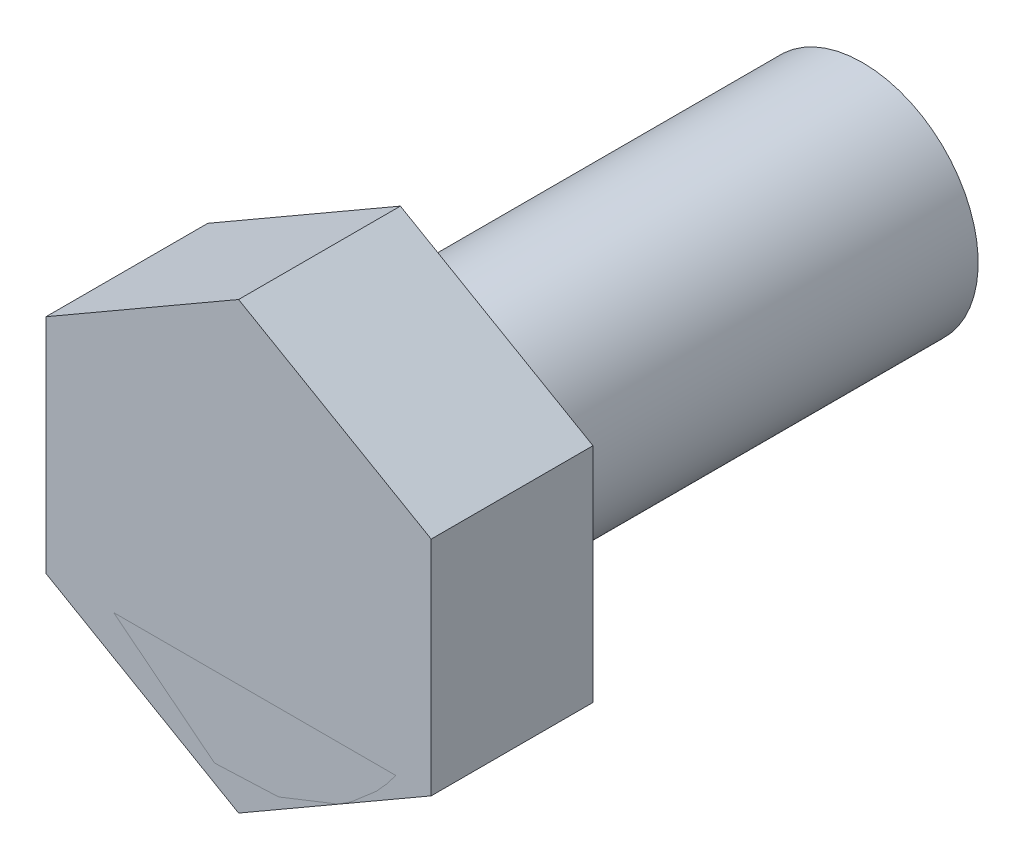
ISO-10303-21;
HEADER;
FILE_DESCRIPTION(('STEP AP214'),'2;1');
FILE_NAME('part.step','',(''),(''),'','','');
FILE_SCHEMA(('AUTOMOTIVE_DESIGN { 1 0 10303 214 1 1 1 1 }'));
ENDSEC;
DATA;
#1=APPLICATION_CONTEXT('core data for automotive mechanical design processes');
#2=APPLICATION_PROTOCOL_DEFINITION('international standard','automotive_design',2000,#1);
#3=PRODUCT_CONTEXT('',#1,'mechanical');
#4=PRODUCT('Part','Part','',(#3));
#5=PRODUCT_RELATED_PRODUCT_CATEGORY('part','',(#4));
#6=PRODUCT_DEFINITION_FORMATION('','',#4);
#7=PRODUCT_DEFINITION_CONTEXT('part definition',#1,'design');
#8=PRODUCT_DEFINITION('design','',#6,#7);
#9=PRODUCT_DEFINITION_SHAPE('','',#8);
#10=(LENGTH_UNIT() NAMED_UNIT(*) SI_UNIT(.MILLI.,.METRE.));
#11=(NAMED_UNIT(*) PLANE_ANGLE_UNIT() SI_UNIT($,.RADIAN.));
#12=(NAMED_UNIT(*) SI_UNIT($,.STERADIAN.) SOLID_ANGLE_UNIT());
#13=UNCERTAINTY_MEASURE_WITH_UNIT(LENGTH_MEASURE(1.E-05),#10,'distance_accuracy_value','');
#14=(GEOMETRIC_REPRESENTATION_CONTEXT(3) GLOBAL_UNCERTAINTY_ASSIGNED_CONTEXT((#13)) GLOBAL_UNIT_ASSIGNED_CONTEXT((#10,
#11,#12)) REPRESENTATION_CONTEXT('',''));
#15=CARTESIAN_POINT('',(0.,0.,0.));
#16=DIRECTION('',(0.,0.,1.));
#17=DIRECTION('',(1.,0.,0.));
#18=AXIS2_PLACEMENT_3D('',#15,#16,#17);
#19=CARTESIAN_POINT('',(5.,2.88675134594813,3.9));
#20=DIRECTION('',(0.5,0.866025403784439,0.));
#21=DIRECTION('',(-0.866025403784439,0.5,0.));
#22=AXIS2_PLACEMENT_3D('',#19,#20,#21);
#23=PLANE('',#22);
#24=DIRECTION('',(-0.866025403784439,0.5,0.));
#25=VECTOR('',#24,1.);
#26=CARTESIAN_POINT('',(5.,2.88675134594813,8.1));
#27=LINE('',#26,#25);
#28=CARTESIAN_POINT('',(5.,2.88675134594813,8.1));
#29=VERTEX_POINT('',#28);
#30=CARTESIAN_POINT('',(0.,5.77350269189626,8.1));
#31=VERTEX_POINT('',#30);
#32=EDGE_CURVE('E130',#29,#31,#27,.T.);
#33=ORIENTED_EDGE('',*,*,#32,.F.);
#34=DIRECTION('',(0.,0.,1.));
#35=VECTOR('',#34,1.);
#36=CARTESIAN_POINT('',(5.,2.88675134594813,3.9));
#37=LINE('',#36,#35);
#38=CARTESIAN_POINT('',(5.,2.88675134594813,3.9));
#39=VERTEX_POINT('',#38);
#40=EDGE_CURVE('E12',#39,#29,#37,.T.);
#41=ORIENTED_EDGE('',*,*,#40,.F.);
#42=DIRECTION('',(-0.866025403784439,0.5,0.));
#43=VECTOR('',#42,1.);
#44=CARTESIAN_POINT('',(5.,2.88675134594813,3.9));
#45=LINE('',#44,#43);
#46=CARTESIAN_POINT('',(0.,5.77350269189626,3.9));
#47=VERTEX_POINT('',#46);
#48=EDGE_CURVE('E144',#39,#47,#45,.T.);
#49=ORIENTED_EDGE('',*,*,#48,.T.);
#50=DIRECTION('',(0.,0.,1.));
#51=VECTOR('',#50,1.);
#52=CARTESIAN_POINT('',(0.,5.77350269189626,3.9));
#53=LINE('',#52,#51);
#54=EDGE_CURVE('E48',#47,#31,#53,.T.);
#55=ORIENTED_EDGE('',*,*,#54,.T.);
#56=EDGE_LOOP('',(#33,#41,#49,#55));
#57=FACE_BOUND('',#56,.T.);
#58=ADVANCED_FACE('F45',(#57),#23,.T.);
#59=CARTESIAN_POINT('',(5.,-2.88675134594813,3.9));
#60=DIRECTION('',(1.,0.,0.));
#61=DIRECTION('',(0.,0.,-1.));
#62=AXIS2_PLACEMENT_3D('',#59,#60,#61);
#63=PLANE('',#62);
#64=DIRECTION('',(0.,1.,0.));
#65=VECTOR('',#64,1.);
#66=CARTESIAN_POINT('',(5.,-2.88675134594813,8.1));
#67=LINE('',#66,#65);
#68=CARTESIAN_POINT('',(5.,-2.88675134594813,8.1));
#69=VERTEX_POINT('',#68);
#70=EDGE_CURVE('E142',#69,#29,#67,.T.);
#71=ORIENTED_EDGE('',*,*,#70,.F.);
#72=DIRECTION('',(0.,0.,1.));
#73=VECTOR('',#72,1.);
#74=CARTESIAN_POINT('',(5.,-2.88675134594813,3.9));
#75=LINE('',#74,#73);
#76=CARTESIAN_POINT('',(5.,-2.88675134594813,3.9));
#77=VERTEX_POINT('',#76);
#78=EDGE_CURVE('E54',#77,#69,#75,.T.);
#79=ORIENTED_EDGE('',*,*,#78,.F.);
#80=DIRECTION('',(0.,1.,0.));
#81=VECTOR('',#80,1.);
#82=CARTESIAN_POINT('',(5.,-2.88675134594813,3.9));
#83=LINE('',#82,#81);
#84=EDGE_CURVE('E120',#77,#39,#83,.T.);
#85=ORIENTED_EDGE('',*,*,#84,.T.);
#86=ORIENTED_EDGE('',*,*,#40,.T.);
#87=EDGE_LOOP('',(#71,#79,#85,#86));
#88=FACE_BOUND('',#87,.T.);
#89=ADVANCED_FACE('F152',(#88),#63,.T.);
#90=CARTESIAN_POINT('',(0.,-5.77350269189626,3.9));
#91=DIRECTION('',(0.5,-0.866025403784439,0.));
#92=DIRECTION('',(0.866025403784439,0.5,0.));
#93=AXIS2_PLACEMENT_3D('',#90,#91,#92);
#94=PLANE('',#93);
#95=DIRECTION('',(0.866025403784439,0.5,0.));
#96=VECTOR('',#95,1.);
#97=CARTESIAN_POINT('',(0.,-5.77350269189626,8.1));
#98=LINE('',#97,#96);
#99=CARTESIAN_POINT('',(0.,-5.77350269189626,8.1));
#100=VERTEX_POINT('',#99);
#101=EDGE_CURVE('E107',#100,#69,#98,.T.);
#102=ORIENTED_EDGE('',*,*,#101,.F.);
#103=DIRECTION('',(0.,0.,1.));
#104=VECTOR('',#103,1.);
#105=CARTESIAN_POINT('',(0.,-5.77350269189626,3.9));
#106=LINE('',#105,#104);
#107=CARTESIAN_POINT('',(0.,-5.77350269189626,3.9));
#108=VERTEX_POINT('',#107);
#109=EDGE_CURVE('E102',#108,#100,#106,.T.);
#110=ORIENTED_EDGE('',*,*,#109,.F.);
#111=DIRECTION('',(0.866025403784439,0.5,0.));
#112=VECTOR('',#111,1.);
#113=CARTESIAN_POINT('',(0.,-5.77350269189626,3.9));
#114=LINE('',#113,#112);
#115=EDGE_CURVE('E105',#108,#77,#114,.T.);
#116=ORIENTED_EDGE('',*,*,#115,.T.);
#117=ORIENTED_EDGE('',*,*,#78,.T.);
#118=EDGE_LOOP('',(#102,#110,#116,#117));
#119=FACE_BOUND('',#118,.T.);
#120=ADVANCED_FACE('F104',(#119),#94,.T.);
#121=CARTESIAN_POINT('',(-5.,-2.88675134594813,3.9));
#122=DIRECTION('',(-0.5,-0.866025403784439,0.));
#123=DIRECTION('',(0.866025403784439,-0.5,0.));
#124=AXIS2_PLACEMENT_3D('',#121,#122,#123);
#125=PLANE('',#124);
#126=DIRECTION('',(0.866025403784439,-0.5,0.));
#127=VECTOR('',#126,1.);
#128=CARTESIAN_POINT('',(-5.,-2.88675134594813,8.1));
#129=LINE('',#128,#127);
#130=CARTESIAN_POINT('',(-5.,-2.88675134594813,8.1));
#131=VERTEX_POINT('',#130);
#132=EDGE_CURVE('E139',#131,#100,#129,.T.);
#133=ORIENTED_EDGE('',*,*,#132,.F.);
#134=DIRECTION('',(0.,0.,1.));
#135=VECTOR('',#134,1.);
#136=CARTESIAN_POINT('',(-5.,-2.88675134594813,3.9));
#137=LINE('',#136,#135);
#138=CARTESIAN_POINT('',(-5.,-2.88675134594813,3.9));
#139=VERTEX_POINT('',#138);
#140=EDGE_CURVE('E112',#139,#131,#137,.T.);
#141=ORIENTED_EDGE('',*,*,#140,.F.);
#142=DIRECTION('',(0.866025403784439,-0.5,0.));
#143=VECTOR('',#142,1.);
#144=CARTESIAN_POINT('',(-5.,-2.88675134594813,3.9));
#145=LINE('',#144,#143);
#146=EDGE_CURVE('E118',#139,#108,#145,.T.);
#147=ORIENTED_EDGE('',*,*,#146,.T.);
#148=ORIENTED_EDGE('',*,*,#109,.T.);
#149=EDGE_LOOP('',(#133,#141,#147,#148));
#150=FACE_BOUND('',#149,.T.);
#151=ADVANCED_FACE('F122',(#150),#125,.T.);
#152=CARTESIAN_POINT('',(-5.,2.88675134594813,3.9));
#153=DIRECTION('',(-1.,0.,0.));
#154=DIRECTION('',(0.,0.,1.));
#155=AXIS2_PLACEMENT_3D('',#152,#153,#154);
#156=PLANE('',#155);
#157=DIRECTION('',(0.,-1.,0.));
#158=VECTOR('',#157,1.);
#159=CARTESIAN_POINT('',(-5.,2.88675134594813,8.1));
#160=LINE('',#159,#158);
#161=CARTESIAN_POINT('',(-5.,2.88675134594813,8.1));
#162=VERTEX_POINT('',#161);
#163=EDGE_CURVE('E136',#162,#131,#160,.T.);
#164=ORIENTED_EDGE('',*,*,#163,.F.);
#165=DIRECTION('',(0.,0.,1.));
#166=VECTOR('',#165,1.);
#167=CARTESIAN_POINT('',(-5.,2.88675134594813,3.9));
#168=LINE('',#167,#166);
#169=CARTESIAN_POINT('',(-5.,2.88675134594813,3.9));
#170=VERTEX_POINT('',#169);
#171=EDGE_CURVE('E147',#170,#162,#168,.T.);
#172=ORIENTED_EDGE('',*,*,#171,.F.);
#173=DIRECTION('',(0.,-1.,0.));
#174=VECTOR('',#173,1.);
#175=CARTESIAN_POINT('',(-5.,2.88675134594813,3.9));
#176=LINE('',#175,#174);
#177=EDGE_CURVE('E123',#170,#139,#176,.T.);
#178=ORIENTED_EDGE('',*,*,#177,.T.);
#179=ORIENTED_EDGE('',*,*,#140,.T.);
#180=EDGE_LOOP('',(#164,#172,#178,#179));
#181=FACE_BOUND('',#180,.T.);
#182=ADVANCED_FACE('F165',(#181),#156,.T.);
#183=CARTESIAN_POINT('',(0.,5.77350269189626,3.9));
#184=DIRECTION('',(-0.5,0.866025403784439,0.));
#185=DIRECTION('',(-0.866025403784439,-0.5,0.));
#186=AXIS2_PLACEMENT_3D('',#183,#184,#185);
#187=PLANE('',#186);
#188=DIRECTION('',(-0.866025403784439,-0.5,0.));
#189=VECTOR('',#188,1.);
#190=CARTESIAN_POINT('',(0.,5.77350269189626,8.1));
#191=LINE('',#190,#189);
#192=EDGE_CURVE('E133',#31,#162,#191,.T.);
#193=ORIENTED_EDGE('',*,*,#192,.F.);
#194=ORIENTED_EDGE('',*,*,#54,.F.);
#195=DIRECTION('',(-0.866025403784439,-0.5,0.));
#196=VECTOR('',#195,1.);
#197=CARTESIAN_POINT('',(0.,5.77350269189626,3.9));
#198=LINE('',#197,#196);
#199=EDGE_CURVE('E125',#47,#170,#198,.T.);
#200=ORIENTED_EDGE('',*,*,#199,.T.);
#201=ORIENTED_EDGE('',*,*,#171,.T.);
#202=EDGE_LOOP('',(#193,#194,#200,#201));
#203=FACE_BOUND('',#202,.T.);
#204=ADVANCED_FACE('F149',(#203),#187,.T.);
#205=CARTESIAN_POINT('',(0.,0.,3.9));
#206=DIRECTION('',(0.,0.,1.));
#207=DIRECTION('',(1.,0.,0.));
#208=AXIS2_PLACEMENT_3D('',#205,#206,#207);
#209=PLANE('',#208);
#210=ORIENTED_EDGE('',*,*,#48,.F.);
#211=ORIENTED_EDGE('',*,*,#84,.F.);
#212=ORIENTED_EDGE('',*,*,#115,.F.);
#213=ORIENTED_EDGE('',*,*,#146,.F.);
#214=ORIENTED_EDGE('',*,*,#177,.F.);
#215=ORIENTED_EDGE('',*,*,#199,.F.);
#216=EDGE_LOOP('',(#210,#211,#212,#213,#214,#215));
#217=FACE_BOUND('',#216,.T.);
#218=ADVANCED_FACE('F116',(#217),#209,.F.);
#219=CARTESIAN_POINT('',(0.,0.,8.1));
#220=DIRECTION('',(0.,0.,1.));
#221=DIRECTION('',(1.,0.,0.));
#222=AXIS2_PLACEMENT_3D('',#219,#220,#221);
#223=PLANE('',#222);
#224=ORIENTED_EDGE('',*,*,#32,.T.);
#225=ORIENTED_EDGE('',*,*,#192,.T.);
#226=ORIENTED_EDGE('',*,*,#163,.T.);
#227=ORIENTED_EDGE('',*,*,#132,.T.);
#228=ORIENTED_EDGE('',*,*,#101,.T.);
#229=ORIENTED_EDGE('',*,*,#70,.T.);
#230=EDGE_LOOP('',(#224,#225,#226,#227,#228,#229));
#231=FACE_BOUND('',#230,.T.);
#232=ADVANCED_FACE('F151',(#231),#223,.T.);
#233=CLOSED_SHELL('',(#58,#89,#120,#151,#182,#204,#218,#232));
#234=MANIFOLD_SOLID_BREP('B2',#233);
#235=CARTESIAN_POINT('',(0.,0.,8.1));
#236=DIRECTION('',(0.,0.,1.));
#237=DIRECTION('',(0.,-1.,0.));
#238=AXIS2_PLACEMENT_3D('',#235,#236,#237);
#239=PLANE('',#238);
#240=CARTESIAN_POINT('',(0.,0.,8.10000000000001));
#241=DIRECTION('',(0.,0.,-1.));
#242=DIRECTION('',(0.,1.,0.));
#243=AXIS2_PLACEMENT_3D('',#240,#241,#242);
#244=CIRCLE('',#243,5.);
#245=CARTESIAN_POINT('',(0.,5.,8.10000000000001));
#246=VERTEX_POINT('',#245);
#247=EDGE_CURVE('E44',#246,#246,#244,.T.);
#248=ORIENTED_EDGE('',*,*,#247,.F.);
#249=EDGE_LOOP('',(#248));
#250=FACE_BOUND('',#249,.T.);
#251=ADVANCED_FACE('F221',(#250),#239,.T.);
#252=CARTESIAN_POINT('',(0.,0.,-8.1));
#253=DIRECTION('',(0.,0.,-1.));
#254=DIRECTION('',(0.,1.,0.));
#255=AXIS2_PLACEMENT_3D('',#252,#253,#254);
#256=CYLINDRICAL_SURFACE('',#255,5.);
#257=ORIENTED_EDGE('',*,*,#247,.T.);
#258=EDGE_LOOP('',(#257));
#259=FACE_BOUND('',#258,.T.);
#260=CARTESIAN_POINT('',(0.,0.,3.9));
#261=DIRECTION('',(0.,0.,-1.));
#262=DIRECTION('',(0.,1.,0.));
#263=AXIS2_PLACEMENT_3D('',#260,#261,#262);
#264=CIRCLE('',#263,5.);
#265=CARTESIAN_POINT('',(0.,5.,3.9));
#266=VERTEX_POINT('',#265);
#267=EDGE_CURVE('E227',#266,#266,#264,.T.);
#268=ORIENTED_EDGE('',*,*,#267,.F.);
#269=EDGE_LOOP('',(#268));
#270=FACE_BOUND('',#269,.T.);
#271=ADVANCED_FACE('F253',(#259,#270),#256,.T.);
#272=CARTESIAN_POINT('',(0.,5.,3.9));
#273=DIRECTION('',(0.,0.,-1.));
#274=DIRECTION('',(0.,1.,0.));
#275=AXIS2_PLACEMENT_3D('',#272,#273,#274);
#276=PLANE('',#275);
#277=ORIENTED_EDGE('',*,*,#267,.T.);
#278=EDGE_LOOP('',(#277));
#279=FACE_BOUND('',#278,.T.);
#280=CARTESIAN_POINT('',(0.,0.,3.9));
#281=DIRECTION('',(0.,0.,-1.));
#282=DIRECTION('',(0.,1.,0.));
#283=AXIS2_PLACEMENT_3D('',#280,#281,#282);
#284=CIRCLE('',#283,3.);
#285=CARTESIAN_POINT('',(0.,3.,3.9));
#286=VERTEX_POINT('',#285);
#287=EDGE_CURVE('E231',#286,#286,#284,.T.);
#288=ORIENTED_EDGE('',*,*,#287,.F.);
#289=EDGE_LOOP('',(#288));
#290=FACE_BOUND('',#289,.T.);
#291=ADVANCED_FACE('F245',(#279,#290),#276,.T.);
#292=CARTESIAN_POINT('',(0.,0.,-8.1));
#293=DIRECTION('',(0.,0.,-1.));
#294=DIRECTION('',(0.,1.,0.));
#295=AXIS2_PLACEMENT_3D('',#292,#293,#294);
#296=CYLINDRICAL_SURFACE('',#295,3.);
#297=ORIENTED_EDGE('',*,*,#287,.T.);
#298=EDGE_LOOP('',(#297));
#299=FACE_BOUND('',#298,.T.);
#300=CARTESIAN_POINT('',(0.,0.,-8.1));
#301=DIRECTION('',(0.,0.,-1.));
#302=DIRECTION('',(0.,1.,0.));
#303=AXIS2_PLACEMENT_3D('',#300,#301,#302);
#304=CIRCLE('',#303,3.);
#305=CARTESIAN_POINT('',(0.,3.,-8.1));
#306=VERTEX_POINT('',#305);
#307=EDGE_CURVE('E235',#306,#306,#304,.T.);
#308=ORIENTED_EDGE('',*,*,#307,.F.);
#309=EDGE_LOOP('',(#308));
#310=FACE_BOUND('',#309,.T.);
#311=ADVANCED_FACE('F243',(#299,#310),#296,.T.);
#312=CARTESIAN_POINT('',(0.,3.,-8.1));
#313=DIRECTION('',(0.,0.,-1.));
#314=DIRECTION('',(0.,1.,0.));
#315=AXIS2_PLACEMENT_3D('',#312,#313,#314);
#316=PLANE('',#315);
#317=ORIENTED_EDGE('',*,*,#307,.T.);
#318=EDGE_LOOP('',(#317));
#319=FACE_BOUND('',#318,.T.);
#320=ADVANCED_FACE('F241',(#319),#316,.T.);
#321=CLOSED_SHELL('',(#251,#271,#291,#311,#320));
#322=MANIFOLD_SOLID_BREP('B6',#321);
#323=ADVANCED_BREP_SHAPE_REPRESENTATION('',(#18,#234,#322),#14);
#324=SHAPE_DEFINITION_REPRESENTATION(#9,#323);
ENDSEC;
END-ISO-10303-21;
